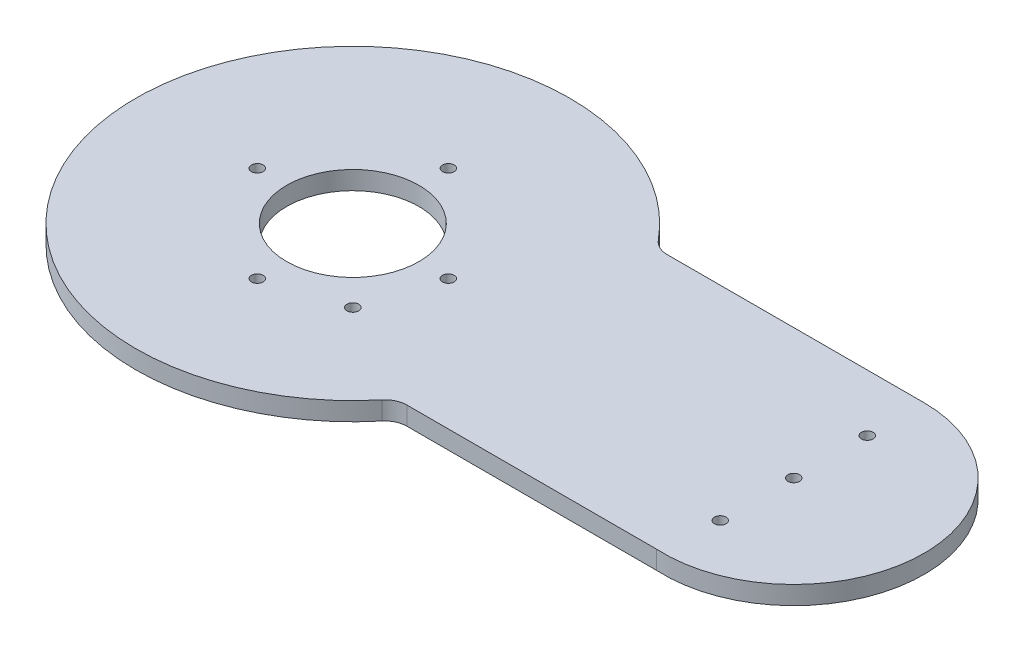
ISO-10303-21;
HEADER;
FILE_DESCRIPTION(('STEP AP214'),'2;1');
FILE_NAME('part.step','',(''),(''),'','','');
FILE_SCHEMA(('AUTOMOTIVE_DESIGN { 1 0 10303 214 1 1 1 1 }'));
ENDSEC;
DATA;
#1=APPLICATION_CONTEXT('core data for automotive mechanical design processes');
#2=APPLICATION_PROTOCOL_DEFINITION('international standard','automotive_design',2000,#1);
#3=PRODUCT_CONTEXT('',#1,'mechanical');
#4=PRODUCT('Part','Part','',(#3));
#5=PRODUCT_RELATED_PRODUCT_CATEGORY('part','',(#4));
#6=PRODUCT_DEFINITION_FORMATION('','',#4);
#7=PRODUCT_DEFINITION_CONTEXT('part definition',#1,'design');
#8=PRODUCT_DEFINITION('design','',#6,#7);
#9=PRODUCT_DEFINITION_SHAPE('','',#8);
#10=(LENGTH_UNIT() NAMED_UNIT(*) SI_UNIT(.MILLI.,.METRE.));
#11=(NAMED_UNIT(*) PLANE_ANGLE_UNIT() SI_UNIT($,.RADIAN.));
#12=(NAMED_UNIT(*) SI_UNIT($,.STERADIAN.) SOLID_ANGLE_UNIT());
#13=UNCERTAINTY_MEASURE_WITH_UNIT(LENGTH_MEASURE(1.E-05),#10,'distance_accuracy_value','');
#14=(GEOMETRIC_REPRESENTATION_CONTEXT(3) GLOBAL_UNCERTAINTY_ASSIGNED_CONTEXT((#13)) GLOBAL_UNIT_ASSIGNED_CONTEXT((#10,
#11,#12)) REPRESENTATION_CONTEXT('',''));
#15=CARTESIAN_POINT('',(0.,0.,0.));
#16=DIRECTION('',(0.,0.,1.));
#17=DIRECTION('',(1.,0.,0.));
#18=AXIS2_PLACEMENT_3D('',#15,#16,#17);
#19=CARTESIAN_POINT('',(-75.0000000000001,6.35,0.));
#20=DIRECTION('',(0.,1.,0.));
#21=DIRECTION('',(0.,0.,1.));
#22=AXIS2_PLACEMENT_3D('',#19,#20,#21);
#23=PLANE('',#22);
#24=CARTESIAN_POINT('',(77.3999999999999,6.35,-25.4));
#25=DIRECTION('',(0.,1.,0.));
#26=DIRECTION('',(0.,0.,1.));
#27=AXIS2_PLACEMENT_3D('',#24,#25,#26);
#28=CIRCLE('',#27,2.0193);
#29=CARTESIAN_POINT('',(77.3999999999999,6.35,-23.3807));
#30=VERTEX_POINT('',#29);
#31=EDGE_CURVE('E281',#30,#30,#28,.T.);
#32=ORIENTED_EDGE('',*,*,#31,.F.);
#33=EDGE_LOOP('',(#32));
#34=FACE_BOUND('',#33,.T.);
#35=CARTESIAN_POINT('',(77.3999999999999,6.35,25.4));
#36=DIRECTION('',(0.,1.,0.));
#37=DIRECTION('',(0.,0.,1.));
#38=AXIS2_PLACEMENT_3D('',#35,#36,#37);
#39=CIRCLE('',#38,2.0193);
#40=CARTESIAN_POINT('',(77.3999999999999,6.35,27.4193));
#41=VERTEX_POINT('',#40);
#42=EDGE_CURVE('E283',#41,#41,#39,.T.);
#43=ORIENTED_EDGE('',*,*,#42,.F.);
#44=EDGE_LOOP('',(#43));
#45=FACE_BOUND('',#44,.T.);
#46=CARTESIAN_POINT('',(-75.0000000000017,6.34999999999999,-33.02));
#47=DIRECTION('',(0.,1.,0.));
#48=DIRECTION('',(0.,0.,1.));
#49=AXIS2_PLACEMENT_3D('',#46,#47,#48);
#50=CIRCLE('',#49,2.0193);
#51=CARTESIAN_POINT('',(-75.0000000000017,6.34999999999999,-31.0007));
#52=VERTEX_POINT('',#51);
#53=EDGE_CURVE('E291',#52,#52,#50,.T.);
#54=ORIENTED_EDGE('',*,*,#53,.F.);
#55=EDGE_LOOP('',(#54));
#56=FACE_BOUND('',#55,.T.);
#57=CARTESIAN_POINT('',(-108.020000000001,6.34999999999999,8.32667268468867E-13));
#58=DIRECTION('',(0.,1.,0.));
#59=DIRECTION('',(0.,0.,1.));
#60=AXIS2_PLACEMENT_3D('',#57,#58,#59);
#61=CIRCLE('',#60,2.01930000000001);
#62=CARTESIAN_POINT('',(-108.020000000001,6.34999999999999,2.01930000000084));
#63=VERTEX_POINT('',#62);
#64=EDGE_CURVE('E295',#63,#63,#61,.T.);
#65=ORIENTED_EDGE('',*,*,#64,.F.);
#66=EDGE_LOOP('',(#65));
#67=FACE_BOUND('',#66,.T.);
#68=CARTESIAN_POINT('',(-75.0000000000001,6.34999999999999,33.02));
#69=DIRECTION('',(0.,1.,0.));
#70=DIRECTION('',(0.,0.,1.));
#71=AXIS2_PLACEMENT_3D('',#68,#69,#70);
#72=CIRCLE('',#71,2.01930000000001);
#73=CARTESIAN_POINT('',(-75.0000000000001,6.34999999999999,35.0393));
#74=VERTEX_POINT('',#73);
#75=EDGE_CURVE('E301',#74,#74,#72,.T.);
#76=ORIENTED_EDGE('',*,*,#75,.F.);
#77=EDGE_LOOP('',(#76));
#78=FACE_BOUND('',#77,.T.);
#79=CARTESIAN_POINT('',(-41.980000000001,6.34999999999999,-5.68989300120393E-13));
#80=DIRECTION('',(0.,1.,0.));
#81=DIRECTION('',(0.,0.,1.));
#82=AXIS2_PLACEMENT_3D('',#79,#80,#81);
#83=CIRCLE('',#82,2.0193);
#84=CARTESIAN_POINT('',(-41.980000000001,6.34999999999999,2.01929999999943));
#85=VERTEX_POINT('',#84);
#86=EDGE_CURVE('E307',#85,#85,#83,.T.);
#87=ORIENTED_EDGE('',*,*,#86,.F.);
#88=EDGE_LOOP('',(#87));
#89=FACE_BOUND('',#88,.T.);
#90=CARTESIAN_POINT('',(-49.8362072459857,6.34999999999999,25.1637927540141));
#91=DIRECTION('',(0.,1.,0.));
#92=DIRECTION('',(0.,0.,1.));
#93=AXIS2_PLACEMENT_3D('',#90,#91,#92);
#94=CIRCLE('',#93,2.0193);
#95=CARTESIAN_POINT('',(-49.8362072459857,6.34999999999999,27.1830927540141));
#96=VERTEX_POINT('',#95);
#97=EDGE_CURVE('E313',#96,#96,#94,.T.);
#98=ORIENTED_EDGE('',*,*,#97,.F.);
#99=EDGE_LOOP('',(#98));
#100=FACE_BOUND('',#99,.T.);
#101=CARTESIAN_POINT('',(-75.0000000000001,6.34999999999999,0.));
#102=DIRECTION('',(0.,1.,0.));
#103=DIRECTION('',(0.,0.,1.));
#104=AXIS2_PLACEMENT_3D('',#101,#102,#103);
#105=CIRCLE('',#104,22.86);
#106=CARTESIAN_POINT('',(-75.0000000000001,6.34999999999999,22.86));
#107=VERTEX_POINT('',#106);
#108=EDGE_CURVE('E319',#107,#107,#105,.T.);
#109=ORIENTED_EDGE('',*,*,#108,.F.);
#110=EDGE_LOOP('',(#109));
#111=FACE_BOUND('',#110,.T.);
#112=DIRECTION('',(-0.999999760457814,0.,0.000692159168831111));
#113=VECTOR('',#112,1.);
#114=CARTESIAN_POINT('',(77.3999999999998,6.35,-45.063954553501));
#115=LINE('',#114,#113);
#116=CARTESIAN_POINT('',(77.3999999999998,6.35,-45.063954553501));
#117=VERTEX_POINT('',#116);
#118=CARTESIAN_POINT('',(-11.2992331029857,6.35,-45.002560551334));
#119=VERTEX_POINT('',#118);
#120=EDGE_CURVE('E111',#117,#119,#115,.T.);
#121=ORIENTED_EDGE('',*,*,#120,.T.);
#122=CARTESIAN_POINT('',(-11.3045073558522,6.35,-52.6225587260225));
#123=DIRECTION('',(0.,1.,0.));
#124=DIRECTION('',(0.,0.,1.));
#125=AXIS2_PLACEMENT_3D('',#122,#123,#124);
#126=CIRCLE('',#125,7.62);
#127=CARTESIAN_POINT('',(-17.1790301648919,6.35,-47.7692730589644));
#128=VERTEX_POINT('',#127);
#129=EDGE_CURVE('E11',#119,#128,#126,.F.);
#130=ORIENTED_EDGE('',*,*,#129,.T.);
#131=CARTESIAN_POINT('',(-75.0000000000001,6.35,0.));
#132=DIRECTION('',(0.,1.,0.));
#133=DIRECTION('',(0.,0.,1.));
#134=AXIS2_PLACEMENT_3D('',#131,#132,#133);
#135=CIRCLE('',#134,75.00112);
#136=CARTESIAN_POINT('',(-17.1771112931276,6.35,47.7669503197245));
#137=VERTEX_POINT('',#136);
#138=EDGE_CURVE('E97',#128,#137,#135,.T.);
#139=ORIENTED_EDGE('',*,*,#138,.T.);
#140=CARTESIAN_POINT('',(-11.3023935296279,6.35,52.62));
#141=DIRECTION('',(0.,1.,0.));
#142=DIRECTION('',(0.,0.,1.));
#143=AXIS2_PLACEMENT_3D('',#140,#141,#142);
#144=CIRCLE('',#143,7.62);
#145=CARTESIAN_POINT('',(-11.3023935296279,6.35,45.));
#146=VERTEX_POINT('',#145);
#147=EDGE_CURVE('E93',#137,#146,#144,.F.);
#148=ORIENTED_EDGE('',*,*,#147,.T.);
#149=DIRECTION('',(1.,0.,0.));
#150=VECTOR('',#149,1.);
#151=CARTESIAN_POINT('',(75.,6.35,45.));
#152=LINE('',#151,#150);
#153=CARTESIAN_POINT('',(75.,6.35,45.));
#154=VERTEX_POINT('',#153);
#155=EDGE_CURVE('E85',#146,#154,#152,.T.);
#156=ORIENTED_EDGE('',*,*,#155,.T.);
#157=CARTESIAN_POINT('',(77.3999999999999,6.35,0.));
#158=DIRECTION('',(0.,1.,0.));
#159=DIRECTION('',(0.,0.,1.));
#160=AXIS2_PLACEMENT_3D('',#157,#158,#159);
#161=CIRCLE('',#160,45.063954553501);
#162=EDGE_CURVE('E89',#154,#117,#161,.T.);
#163=ORIENTED_EDGE('',*,*,#162,.T.);
#164=EDGE_LOOP('',(#121,#130,#139,#148,#156,#163));
#165=FACE_BOUND('',#164,.T.);
#166=CARTESIAN_POINT('',(77.3999999999999,6.35,0.));
#167=DIRECTION('',(0.,1.,0.));
#168=DIRECTION('',(0.,0.,1.));
#169=AXIS2_PLACEMENT_3D('',#166,#167,#168);
#170=CIRCLE('',#169,2.01930000000001);
#171=CARTESIAN_POINT('',(77.3999999999999,6.35,2.01929999999998));
#172=VERTEX_POINT('',#171);
#173=EDGE_CURVE('E119',#172,#172,#170,.T.);
#174=ORIENTED_EDGE('',*,*,#173,.F.);
#175=EDGE_LOOP('',(#174));
#176=FACE_BOUND('',#175,.T.);
#177=ADVANCED_FACE('F33',(#34,#45,#56,#67,#78,#89,#100,#111,#165,#176),#23,.T.);
#178=CARTESIAN_POINT('',(-75.0000000000001,0.,0.));
#179=DIRECTION('',(0.,1.,0.));
#180=DIRECTION('',(0.,0.,1.));
#181=AXIS2_PLACEMENT_3D('',#178,#179,#180);
#182=PLANE('',#181);
#183=CARTESIAN_POINT('',(77.3999999999999,0.,-25.4));
#184=DIRECTION('',(0.,1.,0.));
#185=DIRECTION('',(0.,0.,1.));
#186=AXIS2_PLACEMENT_3D('',#183,#184,#185);
#187=CIRCLE('',#186,2.0193);
#188=CARTESIAN_POINT('',(77.3999999999999,0.,-23.3807));
#189=VERTEX_POINT('',#188);
#190=EDGE_CURVE('E279',#189,#189,#187,.T.);
#191=ORIENTED_EDGE('',*,*,#190,.T.);
#192=EDGE_LOOP('',(#191));
#193=FACE_BOUND('',#192,.T.);
#194=CARTESIAN_POINT('',(77.3999999999999,0.,25.4));
#195=DIRECTION('',(0.,1.,0.));
#196=DIRECTION('',(0.,0.,1.));
#197=AXIS2_PLACEMENT_3D('',#194,#195,#196);
#198=CIRCLE('',#197,2.0193);
#199=CARTESIAN_POINT('',(77.3999999999999,0.,27.4193));
#200=VERTEX_POINT('',#199);
#201=EDGE_CURVE('E288',#200,#200,#198,.T.);
#202=ORIENTED_EDGE('',*,*,#201,.T.);
#203=EDGE_LOOP('',(#202));
#204=FACE_BOUND('',#203,.T.);
#205=CARTESIAN_POINT('',(-75.0000000000017,0.,-33.02));
#206=DIRECTION('',(0.,1.,0.));
#207=DIRECTION('',(0.,0.,1.));
#208=AXIS2_PLACEMENT_3D('',#205,#206,#207);
#209=CIRCLE('',#208,2.0193);
#210=CARTESIAN_POINT('',(-75.0000000000017,0.,-31.0007));
#211=VERTEX_POINT('',#210);
#212=EDGE_CURVE('E292',#211,#211,#209,.T.);
#213=ORIENTED_EDGE('',*,*,#212,.T.);
#214=EDGE_LOOP('',(#213));
#215=FACE_BOUND('',#214,.T.);
#216=CARTESIAN_POINT('',(-108.020000000001,0.,8.32667268468867E-13));
#217=DIRECTION('',(0.,1.,0.));
#218=DIRECTION('',(0.,0.,1.));
#219=AXIS2_PLACEMENT_3D('',#216,#217,#218);
#220=CIRCLE('',#219,2.01930000000001);
#221=CARTESIAN_POINT('',(-108.020000000001,0.,2.01930000000084));
#222=VERTEX_POINT('',#221);
#223=EDGE_CURVE('E298',#222,#222,#220,.T.);
#224=ORIENTED_EDGE('',*,*,#223,.T.);
#225=EDGE_LOOP('',(#224));
#226=FACE_BOUND('',#225,.T.);
#227=CARTESIAN_POINT('',(-75.0000000000001,0.,33.02));
#228=DIRECTION('',(0.,1.,0.));
#229=DIRECTION('',(0.,0.,1.));
#230=AXIS2_PLACEMENT_3D('',#227,#228,#229);
#231=CIRCLE('',#230,2.01930000000001);
#232=CARTESIAN_POINT('',(-75.0000000000001,0.,35.0393));
#233=VERTEX_POINT('',#232);
#234=EDGE_CURVE('E304',#233,#233,#231,.T.);
#235=ORIENTED_EDGE('',*,*,#234,.T.);
#236=EDGE_LOOP('',(#235));
#237=FACE_BOUND('',#236,.T.);
#238=CARTESIAN_POINT('',(-41.980000000001,0.,-5.68989300120393E-13));
#239=DIRECTION('',(0.,1.,0.));
#240=DIRECTION('',(0.,0.,1.));
#241=AXIS2_PLACEMENT_3D('',#238,#239,#240);
#242=CIRCLE('',#241,2.0193);
#243=CARTESIAN_POINT('',(-41.980000000001,0.,2.01929999999943));
#244=VERTEX_POINT('',#243);
#245=EDGE_CURVE('E310',#244,#244,#242,.T.);
#246=ORIENTED_EDGE('',*,*,#245,.T.);
#247=EDGE_LOOP('',(#246));
#248=FACE_BOUND('',#247,.T.);
#249=CARTESIAN_POINT('',(-49.8362072459857,0.,25.1637927540141));
#250=DIRECTION('',(0.,1.,0.));
#251=DIRECTION('',(0.,0.,1.));
#252=AXIS2_PLACEMENT_3D('',#249,#250,#251);
#253=CIRCLE('',#252,2.0193);
#254=CARTESIAN_POINT('',(-49.8362072459857,0.,27.1830927540141));
#255=VERTEX_POINT('',#254);
#256=EDGE_CURVE('E316',#255,#255,#253,.T.);
#257=ORIENTED_EDGE('',*,*,#256,.T.);
#258=EDGE_LOOP('',(#257));
#259=FACE_BOUND('',#258,.T.);
#260=CARTESIAN_POINT('',(-75.0000000000001,0.,0.));
#261=DIRECTION('',(0.,1.,0.));
#262=DIRECTION('',(0.,0.,1.));
#263=AXIS2_PLACEMENT_3D('',#260,#261,#262);
#264=CIRCLE('',#263,22.86);
#265=CARTESIAN_POINT('',(-75.0000000000001,0.,22.86));
#266=VERTEX_POINT('',#265);
#267=EDGE_CURVE('E322',#266,#266,#264,.T.);
#268=ORIENTED_EDGE('',*,*,#267,.T.);
#269=EDGE_LOOP('',(#268));
#270=FACE_BOUND('',#269,.T.);
#271=CARTESIAN_POINT('',(-75.0000000000001,0.,0.));
#272=DIRECTION('',(0.,1.,0.));
#273=DIRECTION('',(0.,0.,1.));
#274=AXIS2_PLACEMENT_3D('',#271,#272,#273);
#275=CIRCLE('',#274,75.00112);
#276=CARTESIAN_POINT('',(-17.1790301648919,0.,-47.7692730589644));
#277=VERTEX_POINT('',#276);
#278=CARTESIAN_POINT('',(-17.1771112931276,0.,47.7669503197245));
#279=VERTEX_POINT('',#278);
#280=EDGE_CURVE('E116',#277,#279,#275,.T.);
#281=ORIENTED_EDGE('',*,*,#280,.F.);
#282=CARTESIAN_POINT('',(-11.3045073558522,0.,-52.6225587260225));
#283=DIRECTION('',(0.,1.,0.));
#284=DIRECTION('',(0.,0.,1.));
#285=AXIS2_PLACEMENT_3D('',#282,#283,#284);
#286=CIRCLE('',#285,7.62);
#287=CARTESIAN_POINT('',(-11.2992331029857,0.,-45.002560551334));
#288=VERTEX_POINT('',#287);
#289=EDGE_CURVE('E41',#277,#288,#286,.T.);
#290=ORIENTED_EDGE('',*,*,#289,.T.);
#291=DIRECTION('',(-0.999999760457814,0.,0.000692159168831111));
#292=VECTOR('',#291,1.);
#293=CARTESIAN_POINT('',(77.3999999999998,0.,-45.063954553501));
#294=LINE('',#293,#292);
#295=CARTESIAN_POINT('',(77.3999999999998,0.,-45.063954553501));
#296=VERTEX_POINT('',#295);
#297=EDGE_CURVE('E123',#296,#288,#294,.T.);
#298=ORIENTED_EDGE('',*,*,#297,.F.);
#299=CARTESIAN_POINT('',(77.3999999999999,0.,0.));
#300=DIRECTION('',(0.,1.,0.));
#301=DIRECTION('',(0.,0.,1.));
#302=AXIS2_PLACEMENT_3D('',#299,#300,#301);
#303=CIRCLE('',#302,45.063954553501);
#304=CARTESIAN_POINT('',(75.,0.,45.));
#305=VERTEX_POINT('',#304);
#306=EDGE_CURVE('E121',#305,#296,#303,.T.);
#307=ORIENTED_EDGE('',*,*,#306,.F.);
#308=DIRECTION('',(1.,0.,0.));
#309=VECTOR('',#308,1.);
#310=CARTESIAN_POINT('',(75.,0.,45.));
#311=LINE('',#310,#309);
#312=CARTESIAN_POINT('',(-11.3023935296279,0.,45.));
#313=VERTEX_POINT('',#312);
#314=EDGE_CURVE('E103',#313,#305,#311,.T.);
#315=ORIENTED_EDGE('',*,*,#314,.F.);
#316=CARTESIAN_POINT('',(-11.3023935296279,0.,52.62));
#317=DIRECTION('',(0.,1.,0.));
#318=DIRECTION('',(0.,0.,1.));
#319=AXIS2_PLACEMENT_3D('',#316,#317,#318);
#320=CIRCLE('',#319,7.62);
#321=EDGE_CURVE('E133',#313,#279,#320,.T.);
#322=ORIENTED_EDGE('',*,*,#321,.T.);
#323=EDGE_LOOP('',(#281,#290,#298,#307,#315,#322));
#324=FACE_BOUND('',#323,.T.);
#325=CARTESIAN_POINT('',(77.3999999999999,0.,0.));
#326=DIRECTION('',(0.,1.,0.));
#327=DIRECTION('',(0.,0.,1.));
#328=AXIS2_PLACEMENT_3D('',#325,#326,#327);
#329=CIRCLE('',#328,2.01930000000001);
#330=CARTESIAN_POINT('',(77.3999999999999,0.,2.01929999999998));
#331=VERTEX_POINT('',#330);
#332=EDGE_CURVE('E325',#331,#331,#329,.T.);
#333=ORIENTED_EDGE('',*,*,#332,.T.);
#334=EDGE_LOOP('',(#333));
#335=FACE_BOUND('',#334,.T.);
#336=ADVANCED_FACE('F135',(#193,#204,#215,#226,#237,#248,#259,#270,#324,#335),#182,.F.);
#337=CARTESIAN_POINT('',(-75.0000000000001,6.35,0.));
#338=DIRECTION('',(0.,-1.,0.));
#339=DIRECTION('',(0.,0.,-1.));
#340=AXIS2_PLACEMENT_3D('',#337,#338,#339);
#341=CYLINDRICAL_SURFACE('',#340,75.00112);
#342=ORIENTED_EDGE('',*,*,#280,.T.);
#343=DIRECTION('',(0.,-1.,0.));
#344=VECTOR('',#343,1.);
#345=CARTESIAN_POINT('',(-17.1771112931276,6.35,47.7669503197245));
#346=LINE('',#345,#344);
#347=EDGE_CURVE('E130',#279,#137,#346,.F.);
#348=ORIENTED_EDGE('',*,*,#347,.T.);
#349=ORIENTED_EDGE('',*,*,#138,.F.);
#350=DIRECTION('',(0.,-1.,0.));
#351=VECTOR('',#350,1.);
#352=CARTESIAN_POINT('',(-17.1790301648919,6.35,-47.7692730589644));
#353=LINE('',#352,#351);
#354=EDGE_CURVE('E127',#128,#277,#353,.T.);
#355=ORIENTED_EDGE('',*,*,#354,.T.);
#356=EDGE_LOOP('',(#342,#348,#349,#355));
#357=FACE_BOUND('',#356,.T.);
#358=ADVANCED_FACE('F140',(#357),#341,.T.);
#359=CARTESIAN_POINT('',(75.,6.35,45.));
#360=DIRECTION('',(0.,0.,-1.));
#361=DIRECTION('',(-1.,0.,0.));
#362=AXIS2_PLACEMENT_3D('',#359,#360,#361);
#363=PLANE('',#362);
#364=ORIENTED_EDGE('',*,*,#155,.F.);
#365=DIRECTION('',(0.,1.,0.));
#366=VECTOR('',#365,1.);
#367=CARTESIAN_POINT('',(-11.3023935296279,0.,45.));
#368=LINE('',#367,#366);
#369=EDGE_CURVE('E106',#146,#313,#368,.F.);
#370=ORIENTED_EDGE('',*,*,#369,.T.);
#371=ORIENTED_EDGE('',*,*,#314,.T.);
#372=DIRECTION('',(0.,-1.,0.));
#373=VECTOR('',#372,1.);
#374=CARTESIAN_POINT('',(75.,6.35,45.));
#375=LINE('',#374,#373);
#376=EDGE_CURVE('E100',#154,#305,#375,.T.);
#377=ORIENTED_EDGE('',*,*,#376,.F.);
#378=EDGE_LOOP('',(#364,#370,#371,#377));
#379=FACE_BOUND('',#378,.T.);
#380=ADVANCED_FACE('F101',(#379),#363,.F.);
#381=CARTESIAN_POINT('',(77.3999999999999,6.35,0.));
#382=DIRECTION('',(0.,-1.,0.));
#383=DIRECTION('',(0.,0.,-1.));
#384=AXIS2_PLACEMENT_3D('',#381,#382,#383);
#385=CYLINDRICAL_SURFACE('',#384,45.063954553501);
#386=ORIENTED_EDGE('',*,*,#306,.T.);
#387=DIRECTION('',(0.,-1.,0.));
#388=VECTOR('',#387,1.);
#389=CARTESIAN_POINT('',(77.3999999999998,6.35,-45.063954553501));
#390=LINE('',#389,#388);
#391=EDGE_CURVE('E107',#117,#296,#390,.T.);
#392=ORIENTED_EDGE('',*,*,#391,.F.);
#393=ORIENTED_EDGE('',*,*,#162,.F.);
#394=ORIENTED_EDGE('',*,*,#376,.T.);
#395=EDGE_LOOP('',(#386,#392,#393,#394));
#396=FACE_BOUND('',#395,.T.);
#397=ADVANCED_FACE('F109',(#396),#385,.T.);
#398=CARTESIAN_POINT('',(77.3999999999998,6.35,-45.063954553501));
#399=DIRECTION('',(0.000692159168831111,0.,0.999999760457814));
#400=DIRECTION('',(0.999999760457814,0.,-0.000692159168831111));
#401=AXIS2_PLACEMENT_3D('',#398,#399,#400);
#402=PLANE('',#401);
#403=ORIENTED_EDGE('',*,*,#297,.T.);
#404=DIRECTION('',(0.,1.,0.));
#405=VECTOR('',#404,1.);
#406=CARTESIAN_POINT('',(-11.2992331029857,6.35,-45.002560551334));
#407=LINE('',#406,#405);
#408=EDGE_CURVE('E48',#288,#119,#407,.T.);
#409=ORIENTED_EDGE('',*,*,#408,.T.);
#410=ORIENTED_EDGE('',*,*,#120,.F.);
#411=ORIENTED_EDGE('',*,*,#391,.T.);
#412=EDGE_LOOP('',(#403,#409,#410,#411));
#413=FACE_BOUND('',#412,.T.);
#414=ADVANCED_FACE('F170',(#413),#402,.F.);
#415=CARTESIAN_POINT('',(77.3999999999999,6.35,0.));
#416=DIRECTION('',(0.,-1.,0.));
#417=DIRECTION('',(0.,0.,-1.));
#418=AXIS2_PLACEMENT_3D('',#415,#416,#417);
#419=CYLINDRICAL_SURFACE('',#418,2.01930000000001);
#420=ORIENTED_EDGE('',*,*,#173,.T.);
#421=EDGE_LOOP('',(#420));
#422=FACE_BOUND('',#421,.T.);
#423=ORIENTED_EDGE('',*,*,#332,.F.);
#424=EDGE_LOOP('',(#423));
#425=FACE_BOUND('',#424,.T.);
#426=ADVANCED_FACE('F167',(#422,#425),#419,.F.);
#427=CARTESIAN_POINT('',(-75.0000000000001,0.,0.));
#428=DIRECTION('',(0.,1.,0.));
#429=DIRECTION('',(0.,0.,1.));
#430=AXIS2_PLACEMENT_3D('',#427,#428,#429);
#431=CYLINDRICAL_SURFACE('',#430,22.86);
#432=ORIENTED_EDGE('',*,*,#267,.F.);
#433=EDGE_LOOP('',(#432));
#434=FACE_BOUND('',#433,.T.);
#435=ORIENTED_EDGE('',*,*,#108,.T.);
#436=EDGE_LOOP('',(#435));
#437=FACE_BOUND('',#436,.T.);
#438=ADVANCED_FACE('F200',(#434,#437),#431,.F.);
#439=CARTESIAN_POINT('',(-49.8362072459857,0.,25.1637927540141));
#440=DIRECTION('',(0.,1.,0.));
#441=DIRECTION('',(0.,0.,1.));
#442=AXIS2_PLACEMENT_3D('',#439,#440,#441);
#443=CYLINDRICAL_SURFACE('',#442,2.0193);
#444=ORIENTED_EDGE('',*,*,#256,.F.);
#445=EDGE_LOOP('',(#444));
#446=FACE_BOUND('',#445,.T.);
#447=ORIENTED_EDGE('',*,*,#97,.T.);
#448=EDGE_LOOP('',(#447));
#449=FACE_BOUND('',#448,.T.);
#450=ADVANCED_FACE('F207',(#446,#449),#443,.F.);
#451=CARTESIAN_POINT('',(-41.980000000001,0.,-5.68989300120393E-13));
#452=DIRECTION('',(0.,1.,0.));
#453=DIRECTION('',(0.,0.,1.));
#454=AXIS2_PLACEMENT_3D('',#451,#452,#453);
#455=CYLINDRICAL_SURFACE('',#454,2.0193);
#456=ORIENTED_EDGE('',*,*,#245,.F.);
#457=EDGE_LOOP('',(#456));
#458=FACE_BOUND('',#457,.T.);
#459=ORIENTED_EDGE('',*,*,#86,.T.);
#460=EDGE_LOOP('',(#459));
#461=FACE_BOUND('',#460,.T.);
#462=ADVANCED_FACE('F214',(#458,#461),#455,.F.);
#463=CARTESIAN_POINT('',(-75.0000000000001,0.,33.02));
#464=DIRECTION('',(0.,1.,0.));
#465=DIRECTION('',(0.,0.,1.));
#466=AXIS2_PLACEMENT_3D('',#463,#464,#465);
#467=CYLINDRICAL_SURFACE('',#466,2.01930000000001);
#468=ORIENTED_EDGE('',*,*,#234,.F.);
#469=EDGE_LOOP('',(#468));
#470=FACE_BOUND('',#469,.T.);
#471=ORIENTED_EDGE('',*,*,#75,.T.);
#472=EDGE_LOOP('',(#471));
#473=FACE_BOUND('',#472,.T.);
#474=ADVANCED_FACE('F222',(#470,#473),#467,.F.);
#475=CARTESIAN_POINT('',(-108.020000000001,0.,8.32667268468867E-13));
#476=DIRECTION('',(0.,1.,0.));
#477=DIRECTION('',(0.,0.,1.));
#478=AXIS2_PLACEMENT_3D('',#475,#476,#477);
#479=CYLINDRICAL_SURFACE('',#478,2.01930000000001);
#480=ORIENTED_EDGE('',*,*,#223,.F.);
#481=EDGE_LOOP('',(#480));
#482=FACE_BOUND('',#481,.T.);
#483=ORIENTED_EDGE('',*,*,#64,.T.);
#484=EDGE_LOOP('',(#483));
#485=FACE_BOUND('',#484,.T.);
#486=ADVANCED_FACE('F152',(#482,#485),#479,.F.);
#487=CARTESIAN_POINT('',(-75.0000000000017,0.,-33.02));
#488=DIRECTION('',(0.,1.,0.));
#489=DIRECTION('',(0.,0.,1.));
#490=AXIS2_PLACEMENT_3D('',#487,#488,#489);
#491=CYLINDRICAL_SURFACE('',#490,2.0193);
#492=ORIENTED_EDGE('',*,*,#212,.F.);
#493=EDGE_LOOP('',(#492));
#494=FACE_BOUND('',#493,.T.);
#495=ORIENTED_EDGE('',*,*,#53,.T.);
#496=EDGE_LOOP('',(#495));
#497=FACE_BOUND('',#496,.T.);
#498=ADVANCED_FACE('F145',(#494,#497),#491,.F.);
#499=CARTESIAN_POINT('',(-11.3023935296279,6.35,52.62));
#500=DIRECTION('',(0.,-1.,0.));
#501=DIRECTION('',(0.,0.,-1.));
#502=AXIS2_PLACEMENT_3D('',#499,#500,#501);
#503=CYLINDRICAL_SURFACE('',#502,7.62);
#504=ORIENTED_EDGE('',*,*,#147,.F.);
#505=ORIENTED_EDGE('',*,*,#347,.F.);
#506=ORIENTED_EDGE('',*,*,#321,.F.);
#507=ORIENTED_EDGE('',*,*,#369,.F.);
#508=EDGE_LOOP('',(#504,#505,#506,#507));
#509=FACE_BOUND('',#508,.T.);
#510=ADVANCED_FACE('F143',(#509),#503,.F.);
#511=CARTESIAN_POINT('',(-11.3045073558522,6.35,-52.6225587260225));
#512=DIRECTION('',(0.,-1.,0.));
#513=DIRECTION('',(0.,0.,-1.));
#514=AXIS2_PLACEMENT_3D('',#511,#512,#513);
#515=CYLINDRICAL_SURFACE('',#514,7.62);
#516=ORIENTED_EDGE('',*,*,#129,.F.);
#517=ORIENTED_EDGE('',*,*,#408,.F.);
#518=ORIENTED_EDGE('',*,*,#289,.F.);
#519=ORIENTED_EDGE('',*,*,#354,.F.);
#520=EDGE_LOOP('',(#516,#517,#518,#519));
#521=FACE_BOUND('',#520,.T.);
#522=ADVANCED_FACE('F35',(#521),#515,.F.);
#523=CARTESIAN_POINT('',(77.3999999999999,6.35,25.4));
#524=DIRECTION('',(0.,1.,0.));
#525=DIRECTION('',(0.,0.,1.));
#526=AXIS2_PLACEMENT_3D('',#523,#524,#525);
#527=CYLINDRICAL_SURFACE('',#526,2.0193);
#528=ORIENTED_EDGE('',*,*,#201,.F.);
#529=EDGE_LOOP('',(#528));
#530=FACE_BOUND('',#529,.T.);
#531=ORIENTED_EDGE('',*,*,#42,.T.);
#532=EDGE_LOOP('',(#531));
#533=FACE_BOUND('',#532,.T.);
#534=ADVANCED_FACE('F150',(#530,#533),#527,.F.);
#535=CARTESIAN_POINT('',(77.3999999999999,6.35,-25.4));
#536=DIRECTION('',(0.,1.,0.));
#537=DIRECTION('',(0.,0.,1.));
#538=AXIS2_PLACEMENT_3D('',#535,#536,#537);
#539=CYLINDRICAL_SURFACE('',#538,2.0193);
#540=ORIENTED_EDGE('',*,*,#190,.F.);
#541=EDGE_LOOP('',(#540));
#542=FACE_BOUND('',#541,.T.);
#543=ORIENTED_EDGE('',*,*,#31,.T.);
#544=EDGE_LOOP('',(#543));
#545=FACE_BOUND('',#544,.T.);
#546=ADVANCED_FACE('F262',(#542,#545),#539,.F.);
#547=CLOSED_SHELL('',(#177,#336,#358,#380,#397,#414,#426,#438,#450,#462,#474,#486,#498,#510,
#522,#534,#546));
#548=MANIFOLD_SOLID_BREP('B2',#547);
#549=ADVANCED_BREP_SHAPE_REPRESENTATION('',(#18,#548),#14);
#550=SHAPE_DEFINITION_REPRESENTATION(#9,#549);
ENDSEC;
END-ISO-10303-21;
